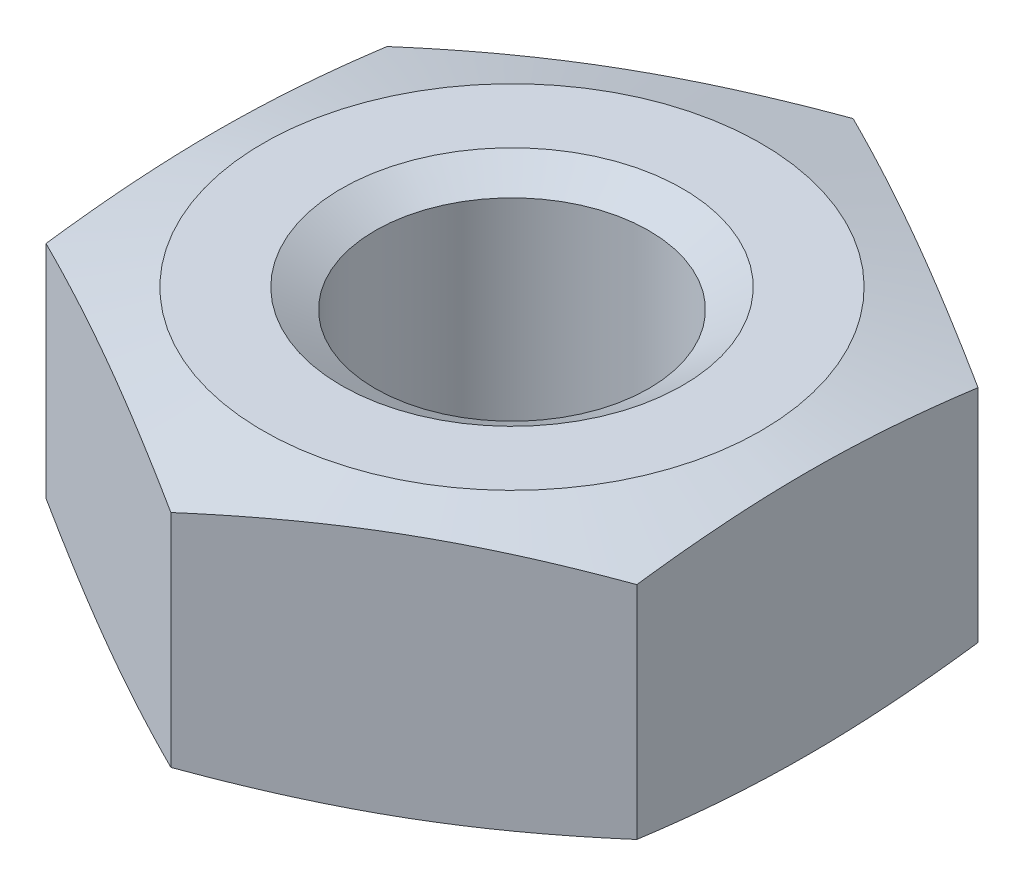
ISO-10303-21;
HEADER;
FILE_DESCRIPTION(('STEP AP214'),'2;1');
FILE_NAME('part.step','',(''),(''),'','','');
FILE_SCHEMA(('AUTOMOTIVE_DESIGN { 1 0 10303 214 1 1 1 1 }'));
ENDSEC;
DATA;
#1=APPLICATION_CONTEXT('core data for automotive mechanical design processes');
#2=APPLICATION_PROTOCOL_DEFINITION('international standard','automotive_design',2000,#1);
#3=PRODUCT_CONTEXT('',#1,'mechanical');
#4=PRODUCT('Part','Part','',(#3));
#5=PRODUCT_RELATED_PRODUCT_CATEGORY('part','',(#4));
#6=PRODUCT_DEFINITION_FORMATION('','',#4);
#7=PRODUCT_DEFINITION_CONTEXT('part definition',#1,'design');
#8=PRODUCT_DEFINITION('design','',#6,#7);
#9=PRODUCT_DEFINITION_SHAPE('','',#8);
#10=(LENGTH_UNIT() NAMED_UNIT(*) SI_UNIT(.MILLI.,.METRE.));
#11=(NAMED_UNIT(*) PLANE_ANGLE_UNIT() SI_UNIT($,.RADIAN.));
#12=(NAMED_UNIT(*) SI_UNIT($,.STERADIAN.) SOLID_ANGLE_UNIT());
#13=UNCERTAINTY_MEASURE_WITH_UNIT(LENGTH_MEASURE(1.E-05),#10,'distance_accuracy_value','');
#14=(GEOMETRIC_REPRESENTATION_CONTEXT(3) GLOBAL_UNCERTAINTY_ASSIGNED_CONTEXT((#13)) GLOBAL_UNIT_ASSIGNED_CONTEXT((#10,
#11,#12)) REPRESENTATION_CONTEXT('',''));
#15=CARTESIAN_POINT('',(0.,0.,0.));
#16=DIRECTION('',(0.,0.,1.));
#17=DIRECTION('',(1.,0.,0.));
#18=AXIS2_PLACEMENT_3D('',#15,#16,#17);
#19=CARTESIAN_POINT('',(3.5,-1.6,-2.02072594216365));
#20=DIRECTION('',(-1.,0.,0.));
#21=DIRECTION('',(0.,0.,1.));
#22=AXIS2_PLACEMENT_3D('',#19,#20,#21);
#23=PLANE('',#22);
#24=CARTESIAN_POINT('',(3.49999999999996,0.512306570033363,6.07294549681872));
#25=CARTESIAN_POINT('',(3.49999999999994,0.546471619445035,5.92576732545527));
#26=CARTESIAN_POINT('',(3.49999999999994,0.580348886545628,5.77852228526966));
#27=CARTESIAN_POINT('',(3.49999999999994,0.647404658481955,5.48387071499446));
#28=CARTESIAN_POINT('',(3.49999999999994,0.68058315171681,5.33646418226649));
#29=CARTESIAN_POINT('',(3.49999999999995,0.778896981362071,4.89390951324849));
#30=CARTESIAN_POINT('',(3.49999999999995,0.842797012031034,4.59848468934752));
#31=CARTESIAN_POINT('',(3.49999999999995,0.966394206167723,4.00388275895328));
#32=CARTESIAN_POINT('',(3.49999999999996,1.02604681611831,3.70469628821029));
#33=CARTESIAN_POINT('',(3.49999999999996,1.1381138811786,3.10492525074023));
#34=CARTESIAN_POINT('',(3.49999999999996,1.19052771971589,2.80434056716968));
#35=CARTESIAN_POINT('',(3.49999999999997,1.28322547529271,2.20952702442787));
#36=CARTESIAN_POINT('',(3.49999999999997,1.32379806133695,1.9153450176916));
#37=CARTESIAN_POINT('',(3.49999999999997,1.37360368234733,1.47285319983174));
#38=CARTESIAN_POINT('',(3.49999999999997,1.38836251918028,1.32516607637025));
#39=CARTESIAN_POINT('',(3.49999999999998,1.41362574091411,1.02943233582066));
#40=CARTESIAN_POINT('',(3.49999999999998,1.42413041852896,0.881385744171722));
#41=CARTESIAN_POINT('',(3.49999999999998,1.44037581881817,0.585667607298372));
#42=CARTESIAN_POINT('',(3.49999999999998,1.44613687782483,0.437997195525124));
#43=CARTESIAN_POINT('',(3.49999999999998,1.45267958895262,0.14254481542006));
#44=CARTESIAN_POINT('',(3.49999999999998,1.45346126289573,-0.00523715242002561));
#45=CARTESIAN_POINT('',(3.49999999999999,1.45000347710282,-0.300752843107427));
#46=CARTESIAN_POINT('',(3.49999999999999,1.44576363554211,-0.44848656143152));
#47=CARTESIAN_POINT('',(3.49999999999999,1.43248246649699,-0.743733027433582));
#48=CARTESIAN_POINT('',(3.5,1.42344114411577,-0.89124577534624));
#49=CARTESIAN_POINT('',(3.5,1.39617679365548,-1.24890660094706));
#50=CARTESIAN_POINT('',(3.5,1.37568115070554,-1.4588814118731));
#51=CARTESIAN_POINT('',(3.5,1.327369091508,-1.87795370324033));
#52=CARTESIAN_POINT('',(3.5,1.29955296751399,-2.08705121836707));
#53=CARTESIAN_POINT('',(3.5,1.23812501877061,-2.505046401143));
#54=CARTESIAN_POINT('',(3.50000000000001,1.20449540496741,-2.71394141591658));
#55=CARTESIAN_POINT('',(3.50000000000001,1.13287347571734,-3.13098367504445));
#56=CARTESIAN_POINT('',(3.50000000000001,1.09488094702124,-3.33913088233439));
#57=CARTESIAN_POINT('',(3.50000000000001,1.01479214183477,-3.75904273527244));
#58=CARTESIAN_POINT('',(3.50000000000002,0.97262783009657,-3.9707943056745));
#59=CARTESIAN_POINT('',(3.50000000000002,0.885711211024596,-4.39376502139933));
#60=CARTESIAN_POINT('',(3.50000000000002,0.840958875355974,-4.60498416086639));
#61=CARTESIAN_POINT('',(3.50000000000002,0.749734758719824,-5.02585943266966));
#62=CARTESIAN_POINT('',(3.50000000000002,0.703273521351702,-5.23551786112918));
#63=CARTESIAN_POINT('',(3.50000000000003,0.608828256024168,-5.65447659686502));
#64=CARTESIAN_POINT('',(3.50000000000004,0.560844334616501,-5.86377692812419));
#65=CARTESIAN_POINT('',(3.50000000000005,0.512306570033364,-6.07294549681866));
#66=B_SPLINE_CURVE_WITH_KNOTS('',3,(#24,#25,#26,#27,#28,#29,#30,#31,#32,#33,#34,#35,#36,#37,#38,
#39,#40,#41,#42,#43,#44,#45,#46,#47,#48,#49,#50,#51,#52,#53,#54,#55,#56,#57,#58,#59,#60,#61,#62,
#63,#64,#65),.UNSPECIFIED.,.F.,.F.,(4,2,2,2,2,2,2,2,2,2,2,2,2,2,2,2,2,2,2,2,4),(0.,
0.453274250333747,0.90655601989642,1.8132994275653,2.72846547991302,3.64370943478975,
4.53430370255605,4.97952108203164,5.42470782243287,5.86797592015564,6.31124207526996,
6.75454193750428,7.19784132858395,7.8305883023178,8.46331001889433,9.09800326591956,
9.73272754850349,10.380432484317,11.0281445128372,11.6723725409908,12.3165555874514),.UNSPECIFIED.);
#67=CARTESIAN_POINT('',(3.5,1.30754634901705,2.02072594216371));
#68=VERTEX_POINT('',#67);
#69=CARTESIAN_POINT('',(3.5,1.30754634901705,-2.02072594216366));
#70=VERTEX_POINT('',#69);
#71=EDGE_CURVE('E88',#68,#70,#66,.T.);
#72=ORIENTED_EDGE('',*,*,#71,.F.);
#73=DIRECTION('',(0.,1.,0.));
#74=VECTOR('',#73,1.);
#75=CARTESIAN_POINT('',(3.5,-1.6,2.02072594216371));
#76=LINE('',#75,#74);
#77=CARTESIAN_POINT('',(3.49999999999996,-1.30754634901705,2.02072594216372));
#78=VERTEX_POINT('',#77);
#79=EDGE_CURVE('E11',#78,#68,#76,.T.);
#80=ORIENTED_EDGE('',*,*,#79,.F.);
#81=CARTESIAN_POINT('',(3.50000000000005,-0.512306570033364,-6.07294549681866));
#82=CARTESIAN_POINT('',(3.50000000000004,-0.546471619445036,-5.92576732545522));
#83=CARTESIAN_POINT('',(3.50000000000003,-0.580348886545629,-5.7785222852696));
#84=CARTESIAN_POINT('',(3.50000000000003,-0.647404658481955,-5.4838707149944));
#85=CARTESIAN_POINT('',(3.50000000000003,-0.68058315171681,-5.33646418226643));
#86=CARTESIAN_POINT('',(3.50000000000002,-0.778896981362072,-4.89390951324843));
#87=CARTESIAN_POINT('',(3.50000000000002,-0.842797012031034,-4.59848468934746));
#88=CARTESIAN_POINT('',(3.50000000000002,-0.966394206167723,-4.00388275895323));
#89=CARTESIAN_POINT('',(3.50000000000001,-1.02604681611831,-3.70469628821023));
#90=CARTESIAN_POINT('',(3.50000000000001,-1.1381138811786,-3.10492525074018));
#91=CARTESIAN_POINT('',(3.50000000000001,-1.19052771971589,-2.80434056716962));
#92=CARTESIAN_POINT('',(3.5,-1.28322547529271,-2.20952702442782));
#93=CARTESIAN_POINT('',(3.5,-1.32379806133695,-1.91534501769154));
#94=CARTESIAN_POINT('',(3.5,-1.37360368234733,-1.47285319983168));
#95=CARTESIAN_POINT('',(3.49999999999999,-1.38836251918028,-1.32516607637019));
#96=CARTESIAN_POINT('',(3.49999999999999,-1.41362574091411,-1.02943233582061));
#97=CARTESIAN_POINT('',(3.49999999999999,-1.42413041852896,-0.881385744171666));
#98=CARTESIAN_POINT('',(3.49999999999999,-1.44037581881817,-0.585667607298317));
#99=CARTESIAN_POINT('',(3.49999999999999,-1.44613687782483,-0.437997195525069));
#100=CARTESIAN_POINT('',(3.49999999999999,-1.45267958895262,-0.142544815420005));
#101=CARTESIAN_POINT('',(3.49999999999999,-1.45346126289573,0.00523715242008025));
#102=CARTESIAN_POINT('',(3.49999999999998,-1.45000347710282,0.300752843107481));
#103=CARTESIAN_POINT('',(3.49999999999998,-1.44576363554211,0.448486561431575));
#104=CARTESIAN_POINT('',(3.49999999999998,-1.43248246649699,0.743733027433637));
#105=CARTESIAN_POINT('',(3.5,-1.42344114411577,0.891245775346294));
#106=CARTESIAN_POINT('',(3.5,-1.39617679365548,1.24890660094712));
#107=CARTESIAN_POINT('',(3.49999999999998,-1.37568115070554,1.45888141187316));
#108=CARTESIAN_POINT('',(3.49999999999996,-1.32736909150799,1.87795370324038));
#109=CARTESIAN_POINT('',(3.49999999999997,-1.29955296751399,2.08705121836713));
#110=CARTESIAN_POINT('',(3.49999999999997,-1.23812501877061,2.50504640114306));
#111=CARTESIAN_POINT('',(3.49999999999996,-1.20449540496741,2.71394141591664));
#112=CARTESIAN_POINT('',(3.49999999999996,-1.13287347571734,3.13098367504451));
#113=CARTESIAN_POINT('',(3.49999999999996,-1.09488094702123,3.33913088233444));
#114=CARTESIAN_POINT('',(3.49999999999995,-1.01479214183476,3.7590427352725));
#115=CARTESIAN_POINT('',(3.49999999999995,-0.972627830096569,3.97079430567456));
#116=CARTESIAN_POINT('',(3.49999999999995,-0.885711211024595,4.39376502139939));
#117=CARTESIAN_POINT('',(3.49999999999995,-0.840958875355973,4.60498416086644));
#118=CARTESIAN_POINT('',(3.49999999999994,-0.749734758719822,5.02585943266972));
#119=CARTESIAN_POINT('',(3.49999999999994,-0.703273521351701,5.23551786112924));
#120=CARTESIAN_POINT('',(3.49999999999994,-0.608828256024166,5.65447659686508));
#121=CARTESIAN_POINT('',(3.49999999999994,-0.560844334616499,5.86377692812425));
#122=CARTESIAN_POINT('',(3.49999999999996,-0.512306570033363,6.07294549681872));
#123=B_SPLINE_CURVE_WITH_KNOTS('',3,(#81,#82,#83,#84,#85,#86,#87,#88,#89,#90,#91,#92,#93,#94,
#95,#96,#97,#98,#99,#100,#101,#102,#103,#104,#105,#106,#107,#108,#109,#110,#111,#112,#113,#114,
#115,#116,#117,#118,#119,#120,#121,#122),.UNSPECIFIED.,.F.,.F.,(4,2,2,2,2,2,2,2,2,2,2,2,2,2,2,2,
2,2,2,2,4),(0.,0.453274250333748,0.906556019896419,1.81329942756529,2.72846547991302,
3.64370943478974,4.53430370255604,4.97952108203163,5.42470782243286,5.86797592015563,
6.31124207526995,6.75454193750427,7.19784132858394,7.83058830231779,8.46331001889433,
9.09800326591955,9.73272754850348,10.380432484317,11.0281445128372,11.6723725409908,
12.3165555874514),.UNSPECIFIED.);
#124=CARTESIAN_POINT('',(3.5,-1.30754634901705,-2.02072594216365));
#125=VERTEX_POINT('',#124);
#126=EDGE_CURVE('E233',#125,#78,#123,.T.);
#127=ORIENTED_EDGE('',*,*,#126,.F.);
#128=DIRECTION('',(0.,1.,0.));
#129=VECTOR('',#128,1.);
#130=CARTESIAN_POINT('',(3.5,-1.6,-2.02072594216365));
#131=LINE('',#130,#129);
#132=EDGE_CURVE('E244',#125,#70,#131,.T.);
#133=ORIENTED_EDGE('',*,*,#132,.T.);
#134=EDGE_LOOP('',(#72,#80,#127,#133));
#135=FACE_BOUND('',#134,.T.);
#136=ADVANCED_FACE('F18',(#135),#23,.F.);
#137=CARTESIAN_POINT('',(3.5,-1.6,2.02072594216371));
#138=DIRECTION('',(-0.5,0.,-0.866025403784442));
#139=DIRECTION('',(-0.866025403784442,0.,0.5));
#140=AXIS2_PLACEMENT_3D('',#137,#138,#139);
#141=PLANE('',#140);
#142=CARTESIAN_POINT('',(-0.0002,1.30751540758341,4.0415673543812));
#143=CARTESIAN_POINT('',(0.145162765094354,1.33001353798489,3.95764212282385));
#144=CARTESIAN_POINT('',(0.290789105593184,1.35043819866886,3.87356471593576));
#145=CARTESIAN_POINT('',(0.582556123983451,1.38632249755761,3.70511294932749));
#146=CARTESIAN_POINT('',(0.728696986526648,1.4017801186684,3.62073848299857));
#147=CARTESIAN_POINT('',(1.02060691245245,1.42682785641646,3.45220420868618));
#148=CARTESIAN_POINT('',(1.16637400154899,1.43644784625336,3.36804554055731));
#149=CARTESIAN_POINT('',(1.45809408806275,1.44934727662974,3.19962087008057));
#150=CARTESIAN_POINT('',(1.60404704403138,1.45262794416288,3.11535489166306));
#151=CARTESIAN_POINT('',(1.89595295596864,1.45262794416288,2.94682293482804));
#152=CARTESIAN_POINT('',(2.04190591193726,1.44934727662974,2.86255695641053));
#153=CARTESIAN_POINT('',(2.33362599845103,1.43644784625336,2.69413228593379));
#154=CARTESIAN_POINT('',(2.47939308754756,1.42682785641646,2.60997361780492));
#155=CARTESIAN_POINT('',(2.77130301347337,1.4017801186684,2.44143934349253));
#156=CARTESIAN_POINT('',(2.91744387601657,1.38632249755761,2.35706487716361));
#157=CARTESIAN_POINT('',(3.20921089440683,1.35043819866886,2.18861311055534));
#158=CARTESIAN_POINT('',(3.35483723490565,1.33001353798489,2.10453570366724));
#159=CARTESIAN_POINT('',(3.5002,1.30751540758341,2.02061047210988));
#160=B_SPLINE_CURVE_WITH_KNOTS('',3,(#142,#143,#144,#145,#146,#147,#148,#149,#150,#151,#152,
#153,#154,#155,#156,#157,#158,#159),.UNSPECIFIED.,.F.,.F.,(4,2,2,2,2,2,2,2,4),(0.,
0.508081243376831,1.01636855642799,1.52203235492775,2.02759827097033,2.5331641870129,
3.03882798551267,3.54711529856382,4.05519654194066),.UNSPECIFIED.);
#161=CARTESIAN_POINT('',(0.,1.30754634901705,4.04145188432737));
#162=VERTEX_POINT('',#161);
#163=EDGE_CURVE('E36',#162,#68,#160,.T.);
#164=ORIENTED_EDGE('',*,*,#163,.F.);
#165=DIRECTION('',(0.,1.,0.));
#166=VECTOR('',#165,1.);
#167=CARTESIAN_POINT('',(0.,-1.6,4.04145188432737));
#168=LINE('',#167,#166);
#169=CARTESIAN_POINT('',(0.,-1.30754634901705,4.04145188432737));
#170=VERTEX_POINT('',#169);
#171=EDGE_CURVE('E28',#170,#162,#168,.T.);
#172=ORIENTED_EDGE('',*,*,#171,.F.);
#173=CARTESIAN_POINT('',(3.5002,-1.30751540758341,2.02061047210988));
#174=CARTESIAN_POINT('',(3.35483723490565,-1.33001353798489,2.10453570366724));
#175=CARTESIAN_POINT('',(3.20921089440683,-1.35043819866886,2.18861311055534));
#176=CARTESIAN_POINT('',(2.91744387601657,-1.38632249755761,2.35706487716361));
#177=CARTESIAN_POINT('',(2.77130301347337,-1.4017801186684,2.44143934349253));
#178=CARTESIAN_POINT('',(2.47939308754756,-1.42682785641646,2.60997361780492));
#179=CARTESIAN_POINT('',(2.33362599845103,-1.43644784625336,2.69413228593379));
#180=CARTESIAN_POINT('',(2.04190591193726,-1.44934727662974,2.86255695641053));
#181=CARTESIAN_POINT('',(1.89595295596864,-1.45262794416288,2.94682293482804));
#182=CARTESIAN_POINT('',(1.60404704403138,-1.45262794416288,3.11535489166306));
#183=CARTESIAN_POINT('',(1.45809408806275,-1.44934727662974,3.19962087008057));
#184=CARTESIAN_POINT('',(1.16637400154899,-1.43644784625336,3.36804554055731));
#185=CARTESIAN_POINT('',(1.02060691245245,-1.42682785641646,3.45220420868618));
#186=CARTESIAN_POINT('',(0.728696986526648,-1.4017801186684,3.62073848299857));
#187=CARTESIAN_POINT('',(0.582556123983451,-1.38632249755761,3.70511294932749));
#188=CARTESIAN_POINT('',(0.290789105593184,-1.35043819866886,3.87356471593576));
#189=CARTESIAN_POINT('',(0.145162765094355,-1.33001353798489,3.95764212282385));
#190=CARTESIAN_POINT('',(-0.000199999999999935,-1.30751540758341,4.0415673543812));
#191=B_SPLINE_CURVE_WITH_KNOTS('',3,(#173,#174,#175,#176,#177,#178,#179,#180,#181,#182,#183,
#184,#185,#186,#187,#188,#189,#190),.UNSPECIFIED.,.F.,.F.,(4,2,2,2,2,2,2,2,4),(0.,
0.508081243376831,1.01636855642799,1.52203235492775,2.02759827097033,2.5331641870129,
3.03882798551266,3.54711529856382,4.05519654194065),.UNSPECIFIED.);
#192=EDGE_CURVE('E227',#78,#170,#191,.T.);
#193=ORIENTED_EDGE('',*,*,#192,.F.);
#194=ORIENTED_EDGE('',*,*,#79,.T.);
#195=EDGE_LOOP('',(#164,#172,#193,#194));
#196=FACE_BOUND('',#195,.T.);
#197=ADVANCED_FACE('F84',(#196),#141,.F.);
#198=CARTESIAN_POINT('',(0.,-1.6,4.04145188432737));
#199=DIRECTION('',(0.5,0.,-0.866025403784439));
#200=DIRECTION('',(-0.866025403784439,0.,-0.5));
#201=AXIS2_PLACEMENT_3D('',#198,#199,#200);
#202=PLANE('',#201);
#203=CARTESIAN_POINT('',(-3.5002,1.30751540758341,2.02061047210983));
#204=CARTESIAN_POINT('',(-3.35483723490566,1.33001353798489,2.10453570366721));
#205=CARTESIAN_POINT('',(-3.20921089440683,1.35043819866886,2.1886131105553));
#206=CARTESIAN_POINT('',(-2.91744387601657,1.38632249755762,2.35706487716358));
#207=CARTESIAN_POINT('',(-2.77130301347337,1.40178011866841,2.4414393434925));
#208=CARTESIAN_POINT('',(-2.47939308754756,1.42682785641647,2.60997361780489));
#209=CARTESIAN_POINT('',(-2.33362599845103,1.43644784625337,2.69413228593376));
#210=CARTESIAN_POINT('',(-2.04190591193726,1.44934727662975,2.8625569564105));
#211=CARTESIAN_POINT('',(-1.89595295596863,1.45262794416288,2.94682293482801));
#212=CARTESIAN_POINT('',(-1.60404704403137,1.45262794416289,3.11535489166303));
#213=CARTESIAN_POINT('',(-1.45809408806275,1.44934727662975,3.19962087008054));
#214=CARTESIAN_POINT('',(-1.16637400154898,1.43644784625337,3.36804554055729));
#215=CARTESIAN_POINT('',(-1.02060691245245,1.42682785641647,3.45220420868616));
#216=CARTESIAN_POINT('',(-0.728696986526639,1.40178011866841,3.62073848299855));
#217=CARTESIAN_POINT('',(-0.58255612398344,1.38632249755762,3.70511294932747));
#218=CARTESIAN_POINT('',(-0.290789105593175,1.35043819866886,3.87356471593574));
#219=CARTESIAN_POINT('',(-0.145162765094348,1.3300135379849,3.95764212282384));
#220=CARTESIAN_POINT('',(0.000199999999999643,1.30751540758341,4.0415673543812));
#221=B_SPLINE_CURVE_WITH_KNOTS('',3,(#203,#204,#205,#206,#207,#208,#209,#210,#211,#212,#213,
#214,#215,#216,#217,#218,#219,#220),.UNSPECIFIED.,.F.,.F.,(4,2,2,2,2,2,2,2,4),(0.,
0.508081243376834,1.016368556428,1.52203235492776,2.02759827097034,2.53316418701292,
3.03882798551268,3.54711529856384,4.05519654194068),.UNSPECIFIED.);
#222=CARTESIAN_POINT('',(-3.5,1.30754634901705,2.02072594216363));
#223=VERTEX_POINT('',#222);
#224=EDGE_CURVE('E72',#223,#162,#221,.T.);
#225=ORIENTED_EDGE('',*,*,#224,.F.);
#226=DIRECTION('',(0.,1.,0.));
#227=VECTOR('',#226,1.);
#228=CARTESIAN_POINT('',(-3.5,-1.6,2.02072594216366));
#229=LINE('',#228,#227);
#230=CARTESIAN_POINT('',(-3.5,-1.30754634901705,2.02072594216363));
#231=VERTEX_POINT('',#230);
#232=EDGE_CURVE('E94',#231,#223,#229,.T.);
#233=ORIENTED_EDGE('',*,*,#232,.F.);
#234=CARTESIAN_POINT('',(0.000200000000000051,-1.30751540758341,4.0415673543812));
#235=CARTESIAN_POINT('',(-0.145162765094348,-1.3300135379849,3.95764212282384));
#236=CARTESIAN_POINT('',(-0.290789105593174,-1.35043819866886,3.87356471593574));
#237=CARTESIAN_POINT('',(-0.58255612398344,-1.38632249755762,3.70511294932747));
#238=CARTESIAN_POINT('',(-0.728696986526639,-1.40178011866841,3.62073848299855));
#239=CARTESIAN_POINT('',(-1.02060691245245,-1.42682785641647,3.45220420868616));
#240=CARTESIAN_POINT('',(-1.16637400154898,-1.43644784625337,3.36804554055729));
#241=CARTESIAN_POINT('',(-1.45809408806275,-1.44934727662975,3.19962087008054));
#242=CARTESIAN_POINT('',(-1.60404704403137,-1.45262794416288,3.11535489166303));
#243=CARTESIAN_POINT('',(-1.89595295596863,-1.45262794416288,2.94682293482801));
#244=CARTESIAN_POINT('',(-2.04190591193726,-1.44934727662975,2.8625569564105));
#245=CARTESIAN_POINT('',(-2.33362599845103,-1.43644784625336,2.69413228593376));
#246=CARTESIAN_POINT('',(-2.47939308754756,-1.42682785641647,2.60997361780489));
#247=CARTESIAN_POINT('',(-2.77130301347337,-1.40178011866841,2.4414393434925));
#248=CARTESIAN_POINT('',(-2.91744387601657,-1.38632249755762,2.35706487716358));
#249=CARTESIAN_POINT('',(-3.20921089440683,-1.35043819866886,2.1886131105553));
#250=CARTESIAN_POINT('',(-3.35483723490566,-1.33001353798489,2.10453570366721));
#251=CARTESIAN_POINT('',(-3.5002,-1.30751540758341,2.02061047210983));
#252=B_SPLINE_CURVE_WITH_KNOTS('',3,(#234,#235,#236,#237,#238,#239,#240,#241,#242,#243,#244,
#245,#246,#247,#248,#249,#250,#251),.UNSPECIFIED.,.F.,.F.,(4,2,2,2,2,2,2,2,4),(0.,
0.508081243376834,1.016368556428,1.52203235492776,2.02759827097034,2.53316418701292,
3.03882798551268,3.54711529856384,4.05519654194068),.UNSPECIFIED.);
#253=EDGE_CURVE('E92',#170,#231,#252,.T.);
#254=ORIENTED_EDGE('',*,*,#253,.F.);
#255=ORIENTED_EDGE('',*,*,#171,.T.);
#256=EDGE_LOOP('',(#225,#233,#254,#255));
#257=FACE_BOUND('',#256,.T.);
#258=ADVANCED_FACE('F91',(#257),#202,.F.);
#259=CARTESIAN_POINT('',(-3.5,-1.6,2.02072594216366));
#260=DIRECTION('',(1.,0.,0.));
#261=DIRECTION('',(0.,0.,-1.));
#262=AXIS2_PLACEMENT_3D('',#259,#260,#261);
#263=PLANE('',#262);
#264=CARTESIAN_POINT('',(-3.49999999999994,0.51230657003336,-6.07294549681873));
#265=CARTESIAN_POINT('',(-3.49999999999993,0.546471619445033,-5.92576732545528));
#266=CARTESIAN_POINT('',(-3.49999999999993,0.580348886545627,-5.77852228526967));
#267=CARTESIAN_POINT('',(-3.49999999999993,0.647404658481954,-5.48387071499447));
#268=CARTESIAN_POINT('',(-3.49999999999993,0.680583151716809,-5.33646418226649));
#269=CARTESIAN_POINT('',(-3.49999999999994,0.77889698136207,-4.8939095132485));
#270=CARTESIAN_POINT('',(-3.49999999999994,0.842797012031033,-4.59848468934753));
#271=CARTESIAN_POINT('',(-3.49999999999994,0.966394206167722,-4.00388275895329));
#272=CARTESIAN_POINT('',(-3.49999999999995,1.02604681611831,-3.7046962882103));
#273=CARTESIAN_POINT('',(-3.49999999999995,1.1381138811786,-3.10492525074024));
#274=CARTESIAN_POINT('',(-3.49999999999996,1.19052771971589,-2.80434056716969));
#275=CARTESIAN_POINT('',(-3.49999999999996,1.28322547529271,-2.20952702442788));
#276=CARTESIAN_POINT('',(-3.49999999999996,1.32379806133695,-1.91534501769161));
#277=CARTESIAN_POINT('',(-3.49999999999997,1.37360368234733,-1.47285319983175));
#278=CARTESIAN_POINT('',(-3.49999999999997,1.38836251918028,-1.32516607637026));
#279=CARTESIAN_POINT('',(-3.49999999999997,1.41362574091411,-1.02943233582067));
#280=CARTESIAN_POINT('',(-3.49999999999997,1.42413041852896,-0.881385744171729));
#281=CARTESIAN_POINT('',(-3.49999999999998,1.44037581881817,-0.58566760729838));
#282=CARTESIAN_POINT('',(-3.49999999999998,1.44613687782483,-0.437997195525131));
#283=CARTESIAN_POINT('',(-3.49999999999998,1.45267958895262,-0.142544815420067));
#284=CARTESIAN_POINT('',(-3.49999999999998,1.45346126289573,0.00523715242001888));
#285=CARTESIAN_POINT('',(-3.49999999999998,1.45000347710282,0.30075284310742));
#286=CARTESIAN_POINT('',(-3.49999999999998,1.44576363554211,0.448486561431514));
#287=CARTESIAN_POINT('',(-3.49999999999999,1.43248246649699,0.743733027433576));
#288=CARTESIAN_POINT('',(-3.5,1.42344114411576,0.891245775346234));
#289=CARTESIAN_POINT('',(-3.5,1.39617679365548,1.24890660094706));
#290=CARTESIAN_POINT('',(-3.5,1.37568115070554,1.4588814118731));
#291=CARTESIAN_POINT('',(-3.5,1.327369091508,1.87795370324033));
#292=CARTESIAN_POINT('',(-3.5,1.29955296751399,2.08705121836707));
#293=CARTESIAN_POINT('',(-3.50000000000001,1.23812501877061,2.505046401143));
#294=CARTESIAN_POINT('',(-3.50000000000001,1.20449540496741,2.71394141591659));
#295=CARTESIAN_POINT('',(-3.50000000000001,1.13287347571734,3.13098367504446));
#296=CARTESIAN_POINT('',(-3.50000000000001,1.09488094702123,3.33913088233439));
#297=CARTESIAN_POINT('',(-3.50000000000002,1.01479214183476,3.75904273527245));
#298=CARTESIAN_POINT('',(-3.50000000000002,0.972627830096567,3.97079430567451));
#299=CARTESIAN_POINT('',(-3.50000000000002,0.885711211024592,4.39376502139934));
#300=CARTESIAN_POINT('',(-3.50000000000002,0.84095887535597,4.6049841608664));
#301=CARTESIAN_POINT('',(-3.50000000000003,0.749734758719819,5.02585943266968));
#302=CARTESIAN_POINT('',(-3.50000000000003,0.703273521351698,5.2355178611292));
#303=CARTESIAN_POINT('',(-3.50000000000003,0.608828256024162,5.65447659686504));
#304=CARTESIAN_POINT('',(-3.50000000000004,0.560844334616494,5.86377692812421));
#305=CARTESIAN_POINT('',(-3.50000000000006,0.512306570033357,6.07294549681868));
#306=B_SPLINE_CURVE_WITH_KNOTS('',3,(#264,#265,#266,#267,#268,#269,#270,#271,#272,#273,#274,
#275,#276,#277,#278,#279,#280,#281,#282,#283,#284,#285,#286,#287,#288,#289,#290,#291,#292,#293,
#294,#295,#296,#297,#298,#299,#300,#301,#302,#303,#304,#305),.UNSPECIFIED.,.F.,.F.,(4,2,2,2,2,2,
2,2,2,2,2,2,2,2,2,2,2,2,2,2,4),(0.,0.453274250333748,0.906556019896421,1.8132994275653,
2.72846547991302,3.64370943478975,4.53430370255605,4.97952108203164,5.42470782243287,
5.86797592015564,6.31124207526996,6.75454193750428,7.19784132858396,7.83058830231781,
8.46331001889435,9.09800326591957,9.73272754850351,10.380432484317,11.0281445128372,
11.6723725409908,12.3165555874514),.UNSPECIFIED.);
#307=CARTESIAN_POINT('',(-3.49999999999996,1.30754634901705,-2.02072594216373));
#308=VERTEX_POINT('',#307);
#309=EDGE_CURVE('E75',#308,#223,#306,.T.);
#310=ORIENTED_EDGE('',*,*,#309,.F.);
#311=DIRECTION('',(0.,1.,0.));
#312=VECTOR('',#311,1.);
#313=CARTESIAN_POINT('',(-3.5,-1.6,-2.02072594216371));
#314=LINE('',#313,#312);
#315=CARTESIAN_POINT('',(-3.49999999999996,-1.30754634901705,-2.02072594216373));
#316=VERTEX_POINT('',#315);
#317=EDGE_CURVE('E99',#316,#308,#314,.T.);
#318=ORIENTED_EDGE('',*,*,#317,.F.);
#319=CARTESIAN_POINT('',(-3.50000000000006,-0.512306570033357,6.07294549681868));
#320=CARTESIAN_POINT('',(-3.50000000000004,-0.546471619445029,5.92576732545523));
#321=CARTESIAN_POINT('',(-3.50000000000004,-0.580348886545623,5.77852228526962));
#322=CARTESIAN_POINT('',(-3.50000000000003,-0.64740465848195,5.48387071499442));
#323=CARTESIAN_POINT('',(-3.50000000000003,-0.680583151716806,5.33646418226644));
#324=CARTESIAN_POINT('',(-3.50000000000003,-0.778896981362068,4.89390951324845));
#325=CARTESIAN_POINT('',(-3.50000000000002,-0.84279701203103,4.59848468934748));
#326=CARTESIAN_POINT('',(-3.50000000000002,-0.96639420616772,4.00388275895324));
#327=CARTESIAN_POINT('',(-3.50000000000002,-1.02604681611831,3.70469628821024));
#328=CARTESIAN_POINT('',(-3.50000000000001,-1.1381138811786,3.10492525074019));
#329=CARTESIAN_POINT('',(-3.50000000000001,-1.19052771971589,2.80434056716963));
#330=CARTESIAN_POINT('',(-3.5,-1.28322547529271,2.20952702442783));
#331=CARTESIAN_POINT('',(-3.5,-1.32379806133694,1.91534501769155));
#332=CARTESIAN_POINT('',(-3.5,-1.37360368234733,1.47285319983169));
#333=CARTESIAN_POINT('',(-3.49999999999999,-1.38836251918028,1.3251660763702));
#334=CARTESIAN_POINT('',(-3.49999999999999,-1.41362574091411,1.02943233582061));
#335=CARTESIAN_POINT('',(-3.49999999999999,-1.42413041852896,0.88138574417167));
#336=CARTESIAN_POINT('',(-3.49999999999999,-1.44037581881817,0.58566760729832));
#337=CARTESIAN_POINT('',(-3.49999999999999,-1.44613687782483,0.437997195525072));
#338=CARTESIAN_POINT('',(-3.49999999999998,-1.45267958895262,0.142544815420007));
#339=CARTESIAN_POINT('',(-3.49999999999998,-1.45346126289573,-0.00523715242007892));
#340=CARTESIAN_POINT('',(-3.49999999999998,-1.45000347710282,-0.300752843107481));
#341=CARTESIAN_POINT('',(-3.49999999999997,-1.44576363554211,-0.448486561431575));
#342=CARTESIAN_POINT('',(-3.49999999999998,-1.43248246649699,-0.743733027433638));
#343=CARTESIAN_POINT('',(-3.5,-1.42344114411576,-0.891245775346296));
#344=CARTESIAN_POINT('',(-3.5,-1.39617679365548,-1.24890660094712));
#345=CARTESIAN_POINT('',(-3.49999999999998,-1.37568115070554,-1.45888141187316));
#346=CARTESIAN_POINT('',(-3.49999999999996,-1.327369091508,-1.87795370324039));
#347=CARTESIAN_POINT('',(-3.49999999999996,-1.29955296751399,-2.08705121836713));
#348=CARTESIAN_POINT('',(-3.49999999999996,-1.23812501877061,-2.50504640114306));
#349=CARTESIAN_POINT('',(-3.49999999999996,-1.20449540496741,-2.71394141591664));
#350=CARTESIAN_POINT('',(-3.49999999999995,-1.13287347571734,-3.13098367504451));
#351=CARTESIAN_POINT('',(-3.49999999999995,-1.09488094702123,-3.33913088233445));
#352=CARTESIAN_POINT('',(-3.49999999999995,-1.01479214183476,-3.75904273527251));
#353=CARTESIAN_POINT('',(-3.49999999999995,-0.972627830096569,-3.97079430567457));
#354=CARTESIAN_POINT('',(-3.49999999999994,-0.885711211024594,-4.3937650213994));
#355=CARTESIAN_POINT('',(-3.49999999999994,-0.840958875355972,-4.60498416086645));
#356=CARTESIAN_POINT('',(-3.49999999999994,-0.749734758719822,-5.02585943266973));
#357=CARTESIAN_POINT('',(-3.49999999999993,-0.7032735213517,-5.23551786112925));
#358=CARTESIAN_POINT('',(-3.49999999999993,-0.608828256024164,-5.65447659686509));
#359=CARTESIAN_POINT('',(-3.49999999999994,-0.560844334616497,-5.86377692812426));
#360=CARTESIAN_POINT('',(-3.49999999999994,-0.51230657003336,-6.07294549681873));
#361=B_SPLINE_CURVE_WITH_KNOTS('',3,(#319,#320,#321,#322,#323,#324,#325,#326,#327,#328,#329,
#330,#331,#332,#333,#334,#335,#336,#337,#338,#339,#340,#341,#342,#343,#344,#345,#346,#347,#348,
#349,#350,#351,#352,#353,#354,#355,#356,#357,#358,#359,#360),.UNSPECIFIED.,.F.,.F.,(4,2,2,2,2,2,
2,2,2,2,2,2,2,2,2,2,2,2,2,2,4),(0.,0.453274250333749,0.906556019896423,1.8132994275653,
2.72846547991303,3.64370943478976,4.53430370255606,4.97952108203165,5.42470782243288,
5.86797592015565,6.31124207526997,6.7545419375043,7.19784132858397,7.83058830231782,
8.46331001889436,9.09800326591958,9.73272754850351,10.380432484317,11.0281445128372,
11.6723725409908,12.3165555874514),.UNSPECIFIED.);
#362=EDGE_CURVE('E214',#231,#316,#361,.T.);
#363=ORIENTED_EDGE('',*,*,#362,.F.);
#364=ORIENTED_EDGE('',*,*,#232,.T.);
#365=EDGE_LOOP('',(#310,#318,#363,#364));
#366=FACE_BOUND('',#365,.T.);
#367=ADVANCED_FACE('F260',(#366),#263,.F.);
#368=CARTESIAN_POINT('',(-3.5,-1.6,-2.02072594216372));
#369=DIRECTION('',(0.499999999999993,0.,0.866025403784443));
#370=DIRECTION('',(0.866025403784443,0.,-0.499999999999993));
#371=AXIS2_PLACEMENT_3D('',#368,#369,#370);
#372=PLANE('',#371);
#373=CARTESIAN_POINT('',(0.000200000000028623,1.30751540758341,-4.04156735438121));
#374=CARTESIAN_POINT('',(-0.145162765094322,1.33001353798489,-3.95764212282385));
#375=CARTESIAN_POINT('',(-0.290789105593151,1.35043819866886,-3.87356471593576));
#376=CARTESIAN_POINT('',(-0.582556123983419,1.38632249755762,-3.70511294932749));
#377=CARTESIAN_POINT('',(-0.728696986526618,1.40178011866841,-3.62073848299857));
#378=CARTESIAN_POINT('',(-1.02060691245243,1.42682785641647,-3.45220420868618));
#379=CARTESIAN_POINT('',(-1.16637400154896,1.43644784625336,-3.36804554055731));
#380=CARTESIAN_POINT('',(-1.45809408806273,1.44934727662974,-3.19962087008057));
#381=CARTESIAN_POINT('',(-1.60404704403136,1.45262794416288,-3.11535489166306));
#382=CARTESIAN_POINT('',(-1.89595295596862,1.45262794416288,-2.94682293482804));
#383=CARTESIAN_POINT('',(-2.04190591193725,1.44934727662974,-2.86255695641054));
#384=CARTESIAN_POINT('',(-2.33362599845102,1.43644784625336,-2.69413228593379));
#385=CARTESIAN_POINT('',(-2.47939308754755,1.42682785641646,-2.60997361780492));
#386=CARTESIAN_POINT('',(-2.77130301347336,1.4017801186684,-2.44143934349254));
#387=CARTESIAN_POINT('',(-2.91744387601656,1.38632249755761,-2.35706487716362));
#388=CARTESIAN_POINT('',(-3.20921089440683,1.35043819866886,-2.18861311055535));
#389=CARTESIAN_POINT('',(-3.35483723490565,1.33001353798489,-2.10453570366725));
#390=CARTESIAN_POINT('',(-3.5002,1.30751540758341,-2.02061047210988));
#391=B_SPLINE_CURVE_WITH_KNOTS('',3,(#373,#374,#375,#376,#377,#378,#379,#380,#381,#382,#383,
#384,#385,#386,#387,#388,#389,#390),.UNSPECIFIED.,.F.,.F.,(4,2,2,2,2,2,2,2,4),(0.,
0.508081243376834,1.016368556428,1.52203235492776,2.02759827097034,2.53316418701292,
3.03882798551269,3.54711529856385,4.05519654194068),.UNSPECIFIED.);
#392=CARTESIAN_POINT('',(0.,1.30754634901705,-4.04145188432737));
#393=VERTEX_POINT('',#392);
#394=EDGE_CURVE('E132',#393,#308,#391,.T.);
#395=ORIENTED_EDGE('',*,*,#394,.F.);
#396=DIRECTION('',(0.,1.,0.));
#397=VECTOR('',#396,1.);
#398=CARTESIAN_POINT('',(0.,-1.6,-4.04145188432738));
#399=LINE('',#398,#397);
#400=CARTESIAN_POINT('',(0.,-1.30754634901705,-4.04145188432737));
#401=VERTEX_POINT('',#400);
#402=EDGE_CURVE('E248',#401,#393,#399,.T.);
#403=ORIENTED_EDGE('',*,*,#402,.F.);
#404=CARTESIAN_POINT('',(-3.5002,-1.30751540758341,-2.02061047210988));
#405=CARTESIAN_POINT('',(-3.35483723490565,-1.33001353798489,-2.10453570366725));
#406=CARTESIAN_POINT('',(-3.20921089440683,-1.35043819866885,-2.18861311055535));
#407=CARTESIAN_POINT('',(-2.91744387601656,-1.38632249755761,-2.35706487716362));
#408=CARTESIAN_POINT('',(-2.77130301347336,-1.4017801186684,-2.44143934349254));
#409=CARTESIAN_POINT('',(-2.47939308754755,-1.42682785641646,-2.60997361780492));
#410=CARTESIAN_POINT('',(-2.33362599845102,-1.43644784625336,-2.69413228593379));
#411=CARTESIAN_POINT('',(-2.04190591193725,-1.44934727662974,-2.86255695641054));
#412=CARTESIAN_POINT('',(-1.89595295596862,-1.45262794416288,-2.94682293482804));
#413=CARTESIAN_POINT('',(-1.60404704403136,-1.45262794416288,-3.11535489166306));
#414=CARTESIAN_POINT('',(-1.45809408806273,-1.44934727662974,-3.19962087008057));
#415=CARTESIAN_POINT('',(-1.16637400154896,-1.43644784625336,-3.36804554055731));
#416=CARTESIAN_POINT('',(-1.02060691245243,-1.42682785641646,-3.45220420868618));
#417=CARTESIAN_POINT('',(-0.728696986526618,-1.40178011866841,-3.62073848299857));
#418=CARTESIAN_POINT('',(-0.582556123983419,-1.38632249755762,-3.70511294932749));
#419=CARTESIAN_POINT('',(-0.290789105593151,-1.35043819866886,-3.87356471593576));
#420=CARTESIAN_POINT('',(-0.145162765094322,-1.33001353798489,-3.95764212282385));
#421=CARTESIAN_POINT('',(0.000200000000028529,-1.30751540758341,-4.04156735438121));
#422=B_SPLINE_CURVE_WITH_KNOTS('',3,(#404,#405,#406,#407,#408,#409,#410,#411,#412,#413,#414,
#415,#416,#417,#418,#419,#420,#421),.UNSPECIFIED.,.F.,.F.,(4,2,2,2,2,2,2,2,4),(0.,
0.508081243376834,1.016368556428,1.52203235492776,2.02759827097034,2.53316418701292,
3.03882798551269,3.54711529856385,4.05519654194068),.UNSPECIFIED.);
#423=EDGE_CURVE('E193',#316,#401,#422,.T.);
#424=ORIENTED_EDGE('',*,*,#423,.F.);
#425=ORIENTED_EDGE('',*,*,#317,.T.);
#426=EDGE_LOOP('',(#395,#403,#424,#425));
#427=FACE_BOUND('',#426,.T.);
#428=ADVANCED_FACE('F256',(#427),#372,.F.);
#429=CARTESIAN_POINT('',(0.,-1.6,-4.04145188432738));
#430=DIRECTION('',(-0.500000000000007,0.,0.866025403784434));
#431=DIRECTION('',(0.866025403784435,0.,0.500000000000007));
#432=AXIS2_PLACEMENT_3D('',#429,#430,#431);
#433=PLANE('',#432);
#434=CARTESIAN_POINT('',(3.5002,1.30751540758341,-2.02061047210982));
#435=CARTESIAN_POINT('',(3.35483723490566,1.3300135379849,-2.10453570366719));
#436=CARTESIAN_POINT('',(3.20921089440683,1.35043819866886,-2.18861311055529));
#437=CARTESIAN_POINT('',(2.91744387601657,1.38632249755762,-2.35706487716357));
#438=CARTESIAN_POINT('',(2.77130301347337,1.40178011866841,-2.44143934349249));
#439=CARTESIAN_POINT('',(2.47939308754757,1.42682785641647,-2.60997361780488));
#440=CARTESIAN_POINT('',(2.33362599845104,1.43644784625337,-2.69413228593375));
#441=CARTESIAN_POINT('',(2.04190591193727,1.44934727662975,-2.8625569564105));
#442=CARTESIAN_POINT('',(1.89595295596864,1.45262794416288,-2.94682293482801));
#443=CARTESIAN_POINT('',(1.60404704403139,1.45262794416288,-3.11535489166303));
#444=CARTESIAN_POINT('',(1.45809408806276,1.44934727662975,-3.19962087008054));
#445=CARTESIAN_POINT('',(1.166374001549,1.43644784625336,-3.36804554055729));
#446=CARTESIAN_POINT('',(1.02060691245247,1.42682785641647,-3.45220420868616));
#447=CARTESIAN_POINT('',(0.728696986526661,1.40178011866841,-3.62073848299855));
#448=CARTESIAN_POINT('',(0.582556123983464,1.38632249755762,-3.70511294932747));
#449=CARTESIAN_POINT('',(0.290789105593201,1.35043819866886,-3.87356471593575));
#450=CARTESIAN_POINT('',(0.145162765094375,1.3300135379849,-3.95764212282384));
#451=CARTESIAN_POINT('',(-0.000199999999970419,1.30751540758341,-4.04156735438121));
#452=B_SPLINE_CURVE_WITH_KNOTS('',3,(#434,#435,#436,#437,#438,#439,#440,#441,#442,#443,#444,
#445,#446,#447,#448,#449,#450,#451),.UNSPECIFIED.,.F.,.F.,(4,2,2,2,2,2,2,2,4),(0.,
0.508081243376832,1.01636855642799,1.52203235492775,2.02759827097033,2.53316418701291,
3.03882798551267,3.54711529856383,4.05519654194066),.UNSPECIFIED.);
#453=EDGE_CURVE('E111',#70,#393,#452,.T.);
#454=ORIENTED_EDGE('',*,*,#453,.F.);
#455=ORIENTED_EDGE('',*,*,#132,.F.);
#456=CARTESIAN_POINT('',(-0.000199999999971201,-1.30751540758341,-4.04156735438121));
#457=CARTESIAN_POINT('',(0.145162765094375,-1.3300135379849,-3.95764212282385));
#458=CARTESIAN_POINT('',(0.2907891055932,-1.35043819866886,-3.87356471593575));
#459=CARTESIAN_POINT('',(0.582556123983463,-1.38632249755762,-3.70511294932747));
#460=CARTESIAN_POINT('',(0.728696986526661,-1.40178011866841,-3.62073848299855));
#461=CARTESIAN_POINT('',(1.02060691245247,-1.42682785641647,-3.45220420868616));
#462=CARTESIAN_POINT('',(1.166374001549,-1.43644784625336,-3.36804554055729));
#463=CARTESIAN_POINT('',(1.45809408806276,-1.44934727662974,-3.19962087008054));
#464=CARTESIAN_POINT('',(1.60404704403139,-1.45262794416288,-3.11535489166303));
#465=CARTESIAN_POINT('',(1.89595295596864,-1.45262794416288,-2.94682293482801));
#466=CARTESIAN_POINT('',(2.04190591193727,-1.44934727662975,-2.8625569564105));
#467=CARTESIAN_POINT('',(2.33362599845104,-1.43644784625336,-2.69413228593375));
#468=CARTESIAN_POINT('',(2.47939308754757,-1.42682785641647,-2.60997361780488));
#469=CARTESIAN_POINT('',(2.77130301347337,-1.40178011866841,-2.44143934349249));
#470=CARTESIAN_POINT('',(2.91744387601657,-1.38632249755762,-2.35706487716357));
#471=CARTESIAN_POINT('',(3.20921089440683,-1.35043819866886,-2.18861311055529));
#472=CARTESIAN_POINT('',(3.35483723490566,-1.3300135379849,-2.10453570366719));
#473=CARTESIAN_POINT('',(3.5002,-1.30751540758341,-2.02061047210982));
#474=B_SPLINE_CURVE_WITH_KNOTS('',3,(#456,#457,#458,#459,#460,#461,#462,#463,#464,#465,#466,
#467,#468,#469,#470,#471,#472,#473),.UNSPECIFIED.,.F.,.F.,(4,2,2,2,2,2,2,2,4),(0.,
0.508081243376832,1.01636855642799,1.52203235492775,2.02759827097033,2.53316418701291,
3.03882798551267,3.54711529856383,4.05519654194066),.UNSPECIFIED.);
#475=EDGE_CURVE('E44',#401,#125,#474,.T.);
#476=ORIENTED_EDGE('',*,*,#475,.F.);
#477=ORIENTED_EDGE('',*,*,#402,.T.);
#478=EDGE_LOOP('',(#454,#455,#476,#477));
#479=FACE_BOUND('',#478,.T.);
#480=ADVANCED_FACE('F20',(#479),#433,.F.);
#481=CARTESIAN_POINT('',(0.,-1.6,0.));
#482=DIRECTION('',(0.,1.,0.));
#483=DIRECTION('',(-1.,0.,0.));
#484=AXIS2_PLACEMENT_3D('',#481,#482,#483);
#485=CONICAL_SURFACE('',#484,2.95,1.30899693899575);
#486=ORIENTED_EDGE('',*,*,#192,.T.);
#487=ORIENTED_EDGE('',*,*,#253,.T.);
#488=ORIENTED_EDGE('',*,*,#362,.T.);
#489=ORIENTED_EDGE('',*,*,#423,.T.);
#490=ORIENTED_EDGE('',*,*,#475,.T.);
#491=ORIENTED_EDGE('',*,*,#126,.T.);
#492=EDGE_LOOP('',(#486,#487,#488,#489,#490,#491));
#493=FACE_BOUND('',#492,.T.);
#494=CARTESIAN_POINT('',(0.,-1.6,0.));
#495=DIRECTION('',(0.,-1.,0.));
#496=DIRECTION('',(1.,0.,0.));
#497=AXIS2_PLACEMENT_3D('',#494,#495,#496);
#498=CIRCLE('',#497,2.95);
#499=CARTESIAN_POINT('',(2.95,-1.6,0.));
#500=VERTEX_POINT('',#499);
#501=EDGE_CURVE('E182',#500,#500,#498,.T.);
#502=ORIENTED_EDGE('',*,*,#501,.F.);
#503=EDGE_LOOP('',(#502));
#504=FACE_BOUND('',#503,.T.);
#505=ADVANCED_FACE('F202',(#493,#504),#485,.T.);
#506=CARTESIAN_POINT('',(0.,-1.6,0.));
#507=DIRECTION('',(0.,-1.,0.));
#508=DIRECTION('',(0.,0.,-1.));
#509=AXIS2_PLACEMENT_3D('',#506,#507,#508);
#510=PLANE('',#509);
#511=CARTESIAN_POINT('',(0.,-1.6,0.));
#512=DIRECTION('',(0.,1.,0.));
#513=DIRECTION('',(0.,0.,1.));
#514=AXIS2_PLACEMENT_3D('',#511,#512,#513);
#515=CIRCLE('',#514,2.021);
#516=CARTESIAN_POINT('',(0.,-1.6,2.021));
#517=VERTEX_POINT('',#516);
#518=EDGE_CURVE('E106',#517,#517,#515,.T.);
#519=ORIENTED_EDGE('',*,*,#518,.T.);
#520=EDGE_LOOP('',(#519));
#521=FACE_BOUND('',#520,.T.);
#522=ORIENTED_EDGE('',*,*,#501,.T.);
#523=EDGE_LOOP('',(#522));
#524=FACE_BOUND('',#523,.T.);
#525=ADVANCED_FACE('F146',(#521,#524),#510,.T.);
#526=CARTESIAN_POINT('',(0.,1.30754634901705,0.));
#527=DIRECTION('',(0.,-1.,0.));
#528=DIRECTION('',(1.,0.,0.));
#529=AXIS2_PLACEMENT_3D('',#526,#527,#528);
#530=CONICAL_SURFACE('',#529,4.04145188432737,1.30899693899575);
#531=CARTESIAN_POINT('',(0.,1.6,0.));
#532=DIRECTION('',(0.,-1.,0.));
#533=DIRECTION('',(1.,0.,0.));
#534=AXIS2_PLACEMENT_3D('',#531,#532,#533);
#535=CIRCLE('',#534,2.95);
#536=CARTESIAN_POINT('',(2.95,1.6,0.));
#537=VERTEX_POINT('',#536);
#538=EDGE_CURVE('E105',#537,#537,#535,.T.);
#539=ORIENTED_EDGE('',*,*,#538,.T.);
#540=EDGE_LOOP('',(#539));
#541=FACE_BOUND('',#540,.T.);
#542=ORIENTED_EDGE('',*,*,#71,.T.);
#543=ORIENTED_EDGE('',*,*,#453,.T.);
#544=ORIENTED_EDGE('',*,*,#394,.T.);
#545=ORIENTED_EDGE('',*,*,#309,.T.);
#546=ORIENTED_EDGE('',*,*,#224,.T.);
#547=ORIENTED_EDGE('',*,*,#163,.T.);
#548=EDGE_LOOP('',(#542,#543,#544,#545,#546,#547));
#549=FACE_BOUND('',#548,.T.);
#550=ADVANCED_FACE('F73',(#541,#549),#530,.T.);
#551=CARTESIAN_POINT('',(0.,1.6,0.));
#552=DIRECTION('',(0.,-1.,0.));
#553=DIRECTION('',(0.,0.,-1.));
#554=AXIS2_PLACEMENT_3D('',#551,#552,#553);
#555=PLANE('',#554);
#556=CARTESIAN_POINT('',(0.,1.6,0.));
#557=DIRECTION('',(0.,-1.,0.));
#558=DIRECTION('',(0.,0.,1.));
#559=AXIS2_PLACEMENT_3D('',#556,#557,#558);
#560=CIRCLE('',#559,2.021);
#561=CARTESIAN_POINT('',(0.,1.6,2.021));
#562=VERTEX_POINT('',#561);
#563=EDGE_CURVE('E121',#562,#562,#560,.T.);
#564=ORIENTED_EDGE('',*,*,#563,.T.);
#565=EDGE_LOOP('',(#564));
#566=FACE_BOUND('',#565,.T.);
#567=ORIENTED_EDGE('',*,*,#538,.F.);
#568=EDGE_LOOP('',(#567));
#569=FACE_BOUND('',#568,.T.);
#570=ADVANCED_FACE('F145',(#566,#569),#555,.F.);
#571=CARTESIAN_POINT('',(0.,9.56124246369254,0.));
#572=DIRECTION('',(0.,-1.,0.));
#573=DIRECTION('',(0.,0.,-1.));
#574=AXIS2_PLACEMENT_3D('',#571,#572,#573);
#575=CYLINDRICAL_SURFACE('',#574,1.621);
#576=CARTESIAN_POINT('',(0.,1.36905989232415,0.));
#577=DIRECTION('',(0.,1.,0.));
#578=DIRECTION('',(0.,0.,1.));
#579=AXIS2_PLACEMENT_3D('',#576,#577,#578);
#580=CIRCLE('',#579,1.621);
#581=CARTESIAN_POINT('',(0.,1.36905989232415,1.621));
#582=VERTEX_POINT('',#581);
#583=EDGE_CURVE('E22',#582,#582,#580,.T.);
#584=ORIENTED_EDGE('',*,*,#583,.T.);
#585=EDGE_LOOP('',(#584));
#586=FACE_BOUND('',#585,.T.);
#587=CARTESIAN_POINT('',(0.,-1.36905989232415,0.));
#588=DIRECTION('',(0.,-1.,0.));
#589=DIRECTION('',(0.,0.,-1.));
#590=AXIS2_PLACEMENT_3D('',#587,#588,#589);
#591=CIRCLE('',#590,1.621);
#592=CARTESIAN_POINT('',(0.,-1.36905989232415,-1.621));
#593=VERTEX_POINT('',#592);
#594=EDGE_CURVE('E102',#593,#593,#591,.T.);
#595=ORIENTED_EDGE('',*,*,#594,.T.);
#596=EDGE_LOOP('',(#595));
#597=FACE_BOUND('',#596,.T.);
#598=ADVANCED_FACE('F148',(#586,#597),#575,.F.);
#599=CARTESIAN_POINT('',(0.,-1.6,0.));
#600=DIRECTION('',(0.,-1.,0.));
#601=DIRECTION('',(0.,0.,1.));
#602=AXIS2_PLACEMENT_3D('',#599,#600,#601);
#603=CONICAL_SURFACE('',#602,2.021,1.0471975511966);
#604=ORIENTED_EDGE('',*,*,#518,.F.);
#605=EDGE_LOOP('',(#604));
#606=FACE_BOUND('',#605,.T.);
#607=ORIENTED_EDGE('',*,*,#594,.F.);
#608=EDGE_LOOP('',(#607));
#609=FACE_BOUND('',#608,.T.);
#610=ADVANCED_FACE('F281',(#606,#609),#603,.F.);
#611=CARTESIAN_POINT('',(0.,1.6,0.));
#612=DIRECTION('',(0.,1.,0.));
#613=DIRECTION('',(0.,0.,1.));
#614=AXIS2_PLACEMENT_3D('',#611,#612,#613);
#615=CONICAL_SURFACE('',#614,2.021,1.0471975511966);
#616=ORIENTED_EDGE('',*,*,#563,.F.);
#617=EDGE_LOOP('',(#616));
#618=FACE_BOUND('',#617,.T.);
#619=ORIENTED_EDGE('',*,*,#583,.F.);
#620=EDGE_LOOP('',(#619));
#621=FACE_BOUND('',#620,.T.);
#622=ADVANCED_FACE('F278',(#618,#621),#615,.F.);
#623=CLOSED_SHELL('',(#136,#197,#258,#367,#428,#480,#505,#525,#550,#570,#598,#610,#622));
#624=MANIFOLD_SOLID_BREP('B1',#623);
#625=ADVANCED_BREP_SHAPE_REPRESENTATION('',(#18,#624),#14);
#626=SHAPE_DEFINITION_REPRESENTATION(#9,#625);
ENDSEC;
END-ISO-10303-21;
